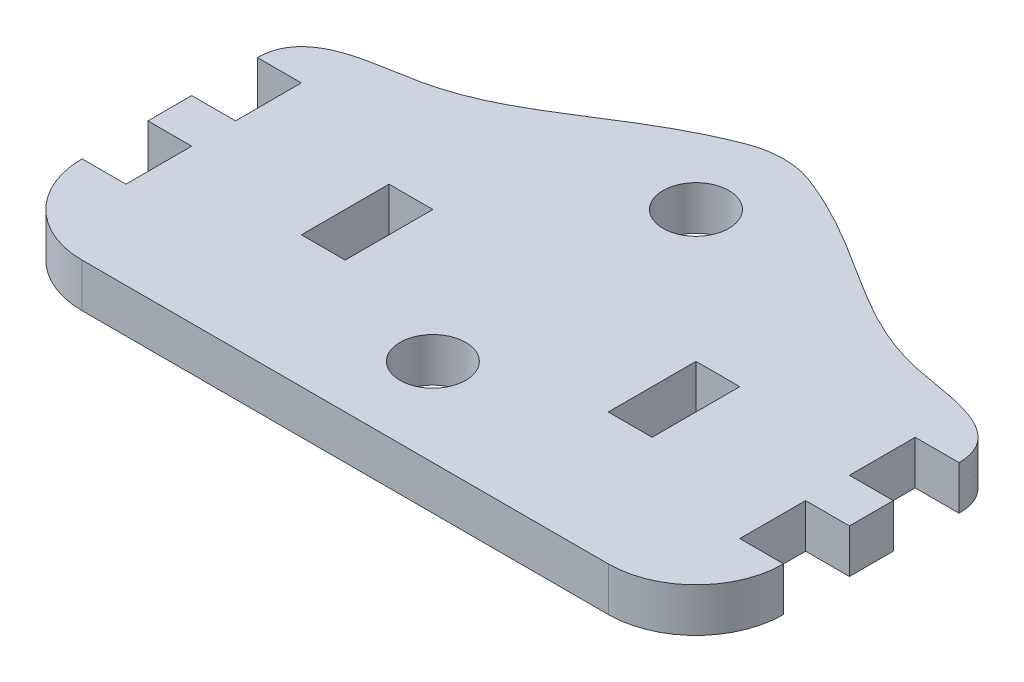
ISO-10303-21;
HEADER;
FILE_DESCRIPTION(('STEP AP214'),'2;1');
FILE_NAME('part.step','',(''),(''),'','','');
FILE_SCHEMA(('AUTOMOTIVE_DESIGN { 1 0 10303 214 1 1 1 1 }'));
ENDSEC;
DATA;
#1=APPLICATION_CONTEXT('core data for automotive mechanical design processes');
#2=APPLICATION_PROTOCOL_DEFINITION('international standard','automotive_design',2000,#1);
#3=PRODUCT_CONTEXT('',#1,'mechanical');
#4=PRODUCT('Part','Part','',(#3));
#5=PRODUCT_RELATED_PRODUCT_CATEGORY('part','',(#4));
#6=PRODUCT_DEFINITION_FORMATION('','',#4);
#7=PRODUCT_DEFINITION_CONTEXT('part definition',#1,'design');
#8=PRODUCT_DEFINITION('design','',#6,#7);
#9=PRODUCT_DEFINITION_SHAPE('','',#8);
#10=(LENGTH_UNIT() NAMED_UNIT(*) SI_UNIT(.MILLI.,.METRE.));
#11=(NAMED_UNIT(*) PLANE_ANGLE_UNIT() SI_UNIT($,.RADIAN.));
#12=(NAMED_UNIT(*) SI_UNIT($,.STERADIAN.) SOLID_ANGLE_UNIT());
#13=UNCERTAINTY_MEASURE_WITH_UNIT(LENGTH_MEASURE(1.E-05),#10,'distance_accuracy_value','');
#14=(GEOMETRIC_REPRESENTATION_CONTEXT(3) GLOBAL_UNCERTAINTY_ASSIGNED_CONTEXT((#13)) GLOBAL_UNIT_ASSIGNED_CONTEXT((#10,
#11,#12)) REPRESENTATION_CONTEXT('',''));
#15=CARTESIAN_POINT('',(0.,0.,0.));
#16=DIRECTION('',(0.,0.,1.));
#17=DIRECTION('',(1.,0.,0.));
#18=AXIS2_PLACEMENT_3D('',#15,#16,#17);
#19=CARTESIAN_POINT('',(-25.4,3.175,-12.7));
#20=CARTESIAN_POINT('',(-25.4,3.175,-13.7590259895496));
#21=CARTESIAN_POINT('',(-23.8903307645993,3.175,-16.5283902462849));
#22=CARTESIAN_POINT('',(-16.1884106721328,3.175,-16.6121941539435));
#23=CARTESIAN_POINT('',(-9.50590726739736,3.175,-21.2331543328215));
#24=CARTESIAN_POINT('',(-4.69237992312142,3.175,-24.0468904274363));
#25=CARTESIAN_POINT('',(-2.2834346962884,3.175,-24.9752363655627));
#26=B_SPLINE_CURVE_WITH_KNOTS('',3,(#19,#20,#21,#22,#23,#24,#25),.UNSPECIFIED.,.F.,.F.,(4,1,1,1,
4),(0.,0.0915734236738152,0.361911298615973,0.725975427728737,1.),.UNSPECIFIED.);
#27=DIRECTION('',(0.,-1.,0.));
#28=VECTOR('',#27,1.);
#29=SURFACE_OF_LINEAR_EXTRUSION('',#26,#28);
#30=CARTESIAN_POINT('',(-25.4,0.,-12.7));
#31=CARTESIAN_POINT('',(-25.4,0.,-13.7590259895496));
#32=CARTESIAN_POINT('',(-23.8903307645993,0.,-16.5283902462849));
#33=CARTESIAN_POINT('',(-16.1884106721328,0.,-16.6121941539435));
#34=CARTESIAN_POINT('',(-9.50590726739736,0.,-21.2331543328215));
#35=CARTESIAN_POINT('',(-4.69237992312142,0.,-24.0468904274363));
#36=CARTESIAN_POINT('',(-2.2834346962884,0.,-24.9752363655627));
#37=B_SPLINE_CURVE_WITH_KNOTS('',3,(#30,#31,#32,#33,#34,#35,#36),.UNSPECIFIED.,.F.,.F.,(4,1,1,1,
4),(0.,0.0915734236738152,0.361911298615973,0.725975427728737,1.),.UNSPECIFIED.);
#38=CARTESIAN_POINT('',(-25.4,0.,-12.7));
#39=VERTEX_POINT('',#38);
#40=CARTESIAN_POINT('',(-2.2834346962884,0.,-24.9752363655627));
#41=VERTEX_POINT('',#40);
#42=EDGE_CURVE('E278',#39,#41,#37,.T.);
#43=ORIENTED_EDGE('',*,*,#42,.F.);
#44=DIRECTION('',(0.,-1.,0.));
#45=VECTOR('',#44,1.);
#46=CARTESIAN_POINT('',(-25.4,3.175,-12.7));
#47=LINE('',#46,#45);
#48=CARTESIAN_POINT('',(-25.4,3.175,-12.7));
#49=VERTEX_POINT('',#48);
#50=EDGE_CURVE('E428',#49,#39,#47,.T.);
#51=ORIENTED_EDGE('',*,*,#50,.F.);
#52=CARTESIAN_POINT('',(-2.2834346962884,3.175,-24.9752363655627));
#53=VERTEX_POINT('',#52);
#54=EDGE_CURVE('E279',#49,#53,#26,.T.);
#55=ORIENTED_EDGE('',*,*,#54,.T.);
#56=DIRECTION('',(0.,-1.,0.));
#57=VECTOR('',#56,1.);
#58=CARTESIAN_POINT('',(-2.2834346962884,3.175,-24.9752363655627));
#59=LINE('',#58,#57);
#60=EDGE_CURVE('E497',#53,#41,#59,.T.);
#61=ORIENTED_EDGE('',*,*,#60,.T.);
#62=EDGE_LOOP('',(#43,#51,#55,#61));
#63=FACE_BOUND('',#62,.T.);
#64=ADVANCED_FACE('F44',(#63),#29,.T.);
#65=CARTESIAN_POINT('',(0.,3.175,-12.7));
#66=DIRECTION('',(0.,0.,1.));
#67=DIRECTION('',(1.,0.,0.));
#68=AXIS2_PLACEMENT_3D('',#65,#66,#67);
#69=PLANE('',#68);
#70=DIRECTION('',(-1.,0.,0.));
#71=VECTOR('',#70,1.);
#72=CARTESIAN_POINT('',(0.,0.,-12.7));
#73=LINE('',#72,#71);
#74=CARTESIAN_POINT('',(-22.225,0.,-12.7));
#75=VERTEX_POINT('',#74);
#76=EDGE_CURVE('E424',#75,#39,#73,.T.);
#77=ORIENTED_EDGE('',*,*,#76,.F.);
#78=DIRECTION('',(0.,-1.,0.));
#79=VECTOR('',#78,1.);
#80=CARTESIAN_POINT('',(-22.225,3.175,-12.7));
#81=LINE('',#80,#79);
#82=CARTESIAN_POINT('',(-22.225,3.175,-12.7));
#83=VERTEX_POINT('',#82);
#84=EDGE_CURVE('E426',#83,#75,#81,.T.);
#85=ORIENTED_EDGE('',*,*,#84,.F.);
#86=DIRECTION('',(-1.,0.,0.));
#87=VECTOR('',#86,1.);
#88=CARTESIAN_POINT('',(0.,3.175,-12.7));
#89=LINE('',#88,#87);
#90=EDGE_CURVE('E285',#83,#49,#89,.T.);
#91=ORIENTED_EDGE('',*,*,#90,.T.);
#92=ORIENTED_EDGE('',*,*,#50,.T.);
#93=EDGE_LOOP('',(#77,#85,#91,#92));
#94=FACE_BOUND('',#93,.T.);
#95=ADVANCED_FACE('F414',(#94),#69,.T.);
#96=CARTESIAN_POINT('',(-22.225,3.175,0.));
#97=DIRECTION('',(-1.,0.,0.));
#98=DIRECTION('',(0.,0.,1.));
#99=AXIS2_PLACEMENT_3D('',#96,#97,#98);
#100=PLANE('',#99);
#101=DIRECTION('',(0.,0.,-1.));
#102=VECTOR('',#101,1.);
#103=CARTESIAN_POINT('',(-22.225,0.,0.));
#104=LINE('',#103,#102);
#105=CARTESIAN_POINT('',(-22.225,0.,-7.93750000000004));
#106=VERTEX_POINT('',#105);
#107=EDGE_CURVE('E432',#106,#75,#104,.T.);
#108=ORIENTED_EDGE('',*,*,#107,.F.);
#109=DIRECTION('',(0.,-1.,0.));
#110=VECTOR('',#109,1.);
#111=CARTESIAN_POINT('',(-22.225,3.175,-7.93750000000004));
#112=LINE('',#111,#110);
#113=CARTESIAN_POINT('',(-22.225,3.175,-7.93750000000004));
#114=VERTEX_POINT('',#113);
#115=EDGE_CURVE('E537',#114,#106,#112,.T.);
#116=ORIENTED_EDGE('',*,*,#115,.F.);
#117=DIRECTION('',(0.,0.,-1.));
#118=VECTOR('',#117,1.);
#119=CARTESIAN_POINT('',(-22.225,3.175,0.));
#120=LINE('',#119,#118);
#121=EDGE_CURVE('E292',#114,#83,#120,.T.);
#122=ORIENTED_EDGE('',*,*,#121,.T.);
#123=ORIENTED_EDGE('',*,*,#84,.T.);
#124=EDGE_LOOP('',(#108,#116,#122,#123));
#125=FACE_BOUND('',#124,.T.);
#126=ADVANCED_FACE('F411',(#125),#100,.T.);
#127=CARTESIAN_POINT('',(0.,3.175,-7.93750000000004));
#128=DIRECTION('',(0.,0.,-1.));
#129=DIRECTION('',(-1.,0.,0.));
#130=AXIS2_PLACEMENT_3D('',#127,#128,#129);
#131=PLANE('',#130);
#132=DIRECTION('',(1.,0.,0.));
#133=VECTOR('',#132,1.);
#134=CARTESIAN_POINT('',(0.,0.,-7.93750000000004));
#135=LINE('',#134,#133);
#136=CARTESIAN_POINT('',(-25.4,0.,-7.93750000000004));
#137=VERTEX_POINT('',#136);
#138=EDGE_CURVE('E440',#137,#106,#135,.T.);
#139=ORIENTED_EDGE('',*,*,#138,.F.);
#140=DIRECTION('',(0.,-1.,0.));
#141=VECTOR('',#140,1.);
#142=CARTESIAN_POINT('',(-25.4,3.175,-7.93750000000004));
#143=LINE('',#142,#141);
#144=CARTESIAN_POINT('',(-25.4,3.175,-7.93750000000004));
#145=VERTEX_POINT('',#144);
#146=EDGE_CURVE('E535',#145,#137,#143,.T.);
#147=ORIENTED_EDGE('',*,*,#146,.F.);
#148=DIRECTION('',(1.,0.,0.));
#149=VECTOR('',#148,1.);
#150=CARTESIAN_POINT('',(0.,3.175,-7.93750000000004));
#151=LINE('',#150,#149);
#152=EDGE_CURVE('E295',#145,#114,#151,.T.);
#153=ORIENTED_EDGE('',*,*,#152,.T.);
#154=ORIENTED_EDGE('',*,*,#115,.T.);
#155=EDGE_LOOP('',(#139,#147,#153,#154));
#156=FACE_BOUND('',#155,.T.);
#157=ADVANCED_FACE('F407',(#156),#131,.T.);
#158=CARTESIAN_POINT('',(-25.4,3.175,0.));
#159=DIRECTION('',(-1.,0.,0.));
#160=DIRECTION('',(0.,0.,1.));
#161=AXIS2_PLACEMENT_3D('',#158,#159,#160);
#162=PLANE('',#161);
#163=DIRECTION('',(0.,0.,-1.));
#164=VECTOR('',#163,1.);
#165=CARTESIAN_POINT('',(-25.4,0.,0.));
#166=LINE('',#165,#164);
#167=CARTESIAN_POINT('',(-25.4,0.,-4.76250000000004));
#168=VERTEX_POINT('',#167);
#169=EDGE_CURVE('E442',#168,#137,#166,.T.);
#170=ORIENTED_EDGE('',*,*,#169,.F.);
#171=DIRECTION('',(0.,-1.,0.));
#172=VECTOR('',#171,1.);
#173=CARTESIAN_POINT('',(-25.4,3.175,-4.76250000000004));
#174=LINE('',#173,#172);
#175=CARTESIAN_POINT('',(-25.4,3.175,-4.76250000000004));
#176=VERTEX_POINT('',#175);
#177=EDGE_CURVE('E533',#176,#168,#174,.T.);
#178=ORIENTED_EDGE('',*,*,#177,.F.);
#179=DIRECTION('',(0.,0.,-1.));
#180=VECTOR('',#179,1.);
#181=CARTESIAN_POINT('',(-25.4,3.175,0.));
#182=LINE('',#181,#180);
#183=EDGE_CURVE('E298',#176,#145,#182,.T.);
#184=ORIENTED_EDGE('',*,*,#183,.T.);
#185=ORIENTED_EDGE('',*,*,#146,.T.);
#186=EDGE_LOOP('',(#170,#178,#184,#185));
#187=FACE_BOUND('',#186,.T.);
#188=ADVANCED_FACE('F403',(#187),#162,.T.);
#189=CARTESIAN_POINT('',(0.,3.175,-4.76250000000004));
#190=DIRECTION('',(0.,0.,-1.));
#191=DIRECTION('',(-1.,0.,0.));
#192=AXIS2_PLACEMENT_3D('',#189,#190,#191);
#193=PLANE('',#192);
#194=DIRECTION('',(1.,0.,0.));
#195=VECTOR('',#194,1.);
#196=CARTESIAN_POINT('',(0.,0.,-4.76250000000004));
#197=LINE('',#196,#195);
#198=CARTESIAN_POINT('',(-22.225,0.,-4.76250000000004));
#199=VERTEX_POINT('',#198);
#200=EDGE_CURVE('E447',#168,#199,#197,.T.);
#201=ORIENTED_EDGE('',*,*,#200,.T.);
#202=DIRECTION('',(0.,-1.,0.));
#203=VECTOR('',#202,1.);
#204=CARTESIAN_POINT('',(-22.225,3.175,-4.76250000000004));
#205=LINE('',#204,#203);
#206=CARTESIAN_POINT('',(-22.225,3.175,-4.76250000000004));
#207=VERTEX_POINT('',#206);
#208=EDGE_CURVE('E531',#207,#199,#205,.T.);
#209=ORIENTED_EDGE('',*,*,#208,.F.);
#210=DIRECTION('',(1.,0.,0.));
#211=VECTOR('',#210,1.);
#212=CARTESIAN_POINT('',(0.,3.175,-4.76250000000004));
#213=LINE('',#212,#211);
#214=EDGE_CURVE('E301',#176,#207,#213,.T.);
#215=ORIENTED_EDGE('',*,*,#214,.F.);
#216=ORIENTED_EDGE('',*,*,#177,.T.);
#217=EDGE_LOOP('',(#201,#209,#215,#216));
#218=FACE_BOUND('',#217,.T.);
#219=ADVANCED_FACE('F399',(#218),#193,.F.);
#220=CARTESIAN_POINT('',(-22.225,3.175,0.));
#221=DIRECTION('',(-1.,0.,0.));
#222=DIRECTION('',(0.,0.,1.));
#223=AXIS2_PLACEMENT_3D('',#220,#221,#222);
#224=PLANE('',#223);
#225=DIRECTION('',(0.,0.,-1.));
#226=VECTOR('',#225,1.);
#227=CARTESIAN_POINT('',(-22.225,0.,0.));
#228=LINE('',#227,#226);
#229=CARTESIAN_POINT('',(-22.225,0.,0.));
#230=VERTEX_POINT('',#229);
#231=EDGE_CURVE('E450',#230,#199,#228,.T.);
#232=ORIENTED_EDGE('',*,*,#231,.F.);
#233=DIRECTION('',(0.,-1.,0.));
#234=VECTOR('',#233,1.);
#235=CARTESIAN_POINT('',(-22.225,3.175,0.));
#236=LINE('',#235,#234);
#237=CARTESIAN_POINT('',(-22.225,3.175,0.));
#238=VERTEX_POINT('',#237);
#239=EDGE_CURVE('E529',#238,#230,#236,.T.);
#240=ORIENTED_EDGE('',*,*,#239,.F.);
#241=DIRECTION('',(0.,0.,-1.));
#242=VECTOR('',#241,1.);
#243=CARTESIAN_POINT('',(-22.225,3.175,0.));
#244=LINE('',#243,#242);
#245=EDGE_CURVE('E303',#238,#207,#244,.T.);
#246=ORIENTED_EDGE('',*,*,#245,.T.);
#247=ORIENTED_EDGE('',*,*,#208,.T.);
#248=EDGE_LOOP('',(#232,#240,#246,#247));
#249=FACE_BOUND('',#248,.T.);
#250=ADVANCED_FACE('F395',(#249),#224,.T.);
#251=CARTESIAN_POINT('',(0.,3.175,0.));
#252=DIRECTION('',(0.,0.,-1.));
#253=DIRECTION('',(-1.,0.,0.));
#254=AXIS2_PLACEMENT_3D('',#251,#252,#253);
#255=PLANE('',#254);
#256=DIRECTION('',(1.,0.,0.));
#257=VECTOR('',#256,1.);
#258=CARTESIAN_POINT('',(0.,0.,0.));
#259=LINE('',#258,#257);
#260=CARTESIAN_POINT('',(-25.4,0.,0.));
#261=VERTEX_POINT('',#260);
#262=EDGE_CURVE('E453',#261,#230,#259,.T.);
#263=ORIENTED_EDGE('',*,*,#262,.F.);
#264=DIRECTION('',(0.,-1.,0.));
#265=VECTOR('',#264,1.);
#266=CARTESIAN_POINT('',(-25.4,3.175,0.));
#267=LINE('',#266,#265);
#268=CARTESIAN_POINT('',(-25.4,3.175,0.));
#269=VERTEX_POINT('',#268);
#270=EDGE_CURVE('E527',#269,#261,#267,.T.);
#271=ORIENTED_EDGE('',*,*,#270,.F.);
#272=DIRECTION('',(1.,0.,0.));
#273=VECTOR('',#272,1.);
#274=CARTESIAN_POINT('',(0.,3.175,0.));
#275=LINE('',#274,#273);
#276=EDGE_CURVE('E306',#269,#238,#275,.T.);
#277=ORIENTED_EDGE('',*,*,#276,.T.);
#278=ORIENTED_EDGE('',*,*,#239,.T.);
#279=EDGE_LOOP('',(#263,#271,#277,#278));
#280=FACE_BOUND('',#279,.T.);
#281=ADVANCED_FACE('F391',(#280),#255,.T.);
#282=CARTESIAN_POINT('',(-19.05,3.175,0.));
#283=DIRECTION('',(0.,-1.,0.));
#284=DIRECTION('',(0.,0.,-1.));
#285=AXIS2_PLACEMENT_3D('',#282,#283,#284);
#286=CYLINDRICAL_SURFACE('',#285,6.35);
#287=CARTESIAN_POINT('',(-19.05,0.,0.));
#288=DIRECTION('',(0.,1.,0.));
#289=DIRECTION('',(0.,0.,1.));
#290=AXIS2_PLACEMENT_3D('',#287,#288,#289);
#291=CIRCLE('',#290,6.35);
#292=CARTESIAN_POINT('',(-19.05,0.,6.35));
#293=VERTEX_POINT('',#292);
#294=EDGE_CURVE('E456',#293,#261,#291,.F.);
#295=ORIENTED_EDGE('',*,*,#294,.F.);
#296=DIRECTION('',(0.,-1.,0.));
#297=VECTOR('',#296,1.);
#298=CARTESIAN_POINT('',(-19.05,3.175,6.35));
#299=LINE('',#298,#297);
#300=CARTESIAN_POINT('',(-19.05,3.175,6.35));
#301=VERTEX_POINT('',#300);
#302=EDGE_CURVE('E525',#301,#293,#299,.T.);
#303=ORIENTED_EDGE('',*,*,#302,.F.);
#304=CARTESIAN_POINT('',(-19.05,3.175,0.));
#305=DIRECTION('',(0.,1.,0.));
#306=DIRECTION('',(0.,0.,1.));
#307=AXIS2_PLACEMENT_3D('',#304,#305,#306);
#308=CIRCLE('',#307,6.35);
#309=EDGE_CURVE('E309',#301,#269,#308,.F.);
#310=ORIENTED_EDGE('',*,*,#309,.T.);
#311=ORIENTED_EDGE('',*,*,#270,.T.);
#312=EDGE_LOOP('',(#295,#303,#310,#311));
#313=FACE_BOUND('',#312,.T.);
#314=ADVANCED_FACE('F387',(#313),#286,.T.);
#315=CARTESIAN_POINT('',(0.,3.175,6.35));
#316=DIRECTION('',(0.,0.,1.));
#317=DIRECTION('',(1.,0.,0.));
#318=AXIS2_PLACEMENT_3D('',#315,#316,#317);
#319=PLANE('',#318);
#320=DIRECTION('',(-1.,0.,0.));
#321=VECTOR('',#320,1.);
#322=CARTESIAN_POINT('',(0.,0.,6.35));
#323=LINE('',#322,#321);
#324=CARTESIAN_POINT('',(19.05,0.,6.35));
#325=VERTEX_POINT('',#324);
#326=EDGE_CURVE('E459',#325,#293,#323,.T.);
#327=ORIENTED_EDGE('',*,*,#326,.F.);
#328=DIRECTION('',(0.,-1.,0.));
#329=VECTOR('',#328,1.);
#330=CARTESIAN_POINT('',(19.05,3.175,6.35));
#331=LINE('',#330,#329);
#332=CARTESIAN_POINT('',(19.05,3.175,6.35));
#333=VERTEX_POINT('',#332);
#334=EDGE_CURVE('E523',#333,#325,#331,.T.);
#335=ORIENTED_EDGE('',*,*,#334,.F.);
#336=DIRECTION('',(-1.,0.,0.));
#337=VECTOR('',#336,1.);
#338=CARTESIAN_POINT('',(0.,3.175,6.35));
#339=LINE('',#338,#337);
#340=EDGE_CURVE('E312',#333,#301,#339,.T.);
#341=ORIENTED_EDGE('',*,*,#340,.T.);
#342=ORIENTED_EDGE('',*,*,#302,.T.);
#343=EDGE_LOOP('',(#327,#335,#341,#342));
#344=FACE_BOUND('',#343,.T.);
#345=ADVANCED_FACE('F383',(#344),#319,.T.);
#346=CARTESIAN_POINT('',(19.05,3.175,0.));
#347=DIRECTION('',(0.,-1.,0.));
#348=DIRECTION('',(0.,0.,-1.));
#349=AXIS2_PLACEMENT_3D('',#346,#347,#348);
#350=CYLINDRICAL_SURFACE('',#349,6.35);
#351=CARTESIAN_POINT('',(19.05,0.,0.));
#352=DIRECTION('',(0.,1.,0.));
#353=DIRECTION('',(0.,0.,1.));
#354=AXIS2_PLACEMENT_3D('',#351,#352,#353);
#355=CIRCLE('',#354,6.35);
#356=CARTESIAN_POINT('',(25.4,0.,0.));
#357=VERTEX_POINT('',#356);
#358=EDGE_CURVE('E462',#325,#357,#355,.T.);
#359=ORIENTED_EDGE('',*,*,#358,.T.);
#360=DIRECTION('',(0.,-1.,0.));
#361=VECTOR('',#360,1.);
#362=CARTESIAN_POINT('',(25.4,3.175,0.));
#363=LINE('',#362,#361);
#364=CARTESIAN_POINT('',(25.4,3.175,0.));
#365=VERTEX_POINT('',#364);
#366=EDGE_CURVE('E520',#365,#357,#363,.T.);
#367=ORIENTED_EDGE('',*,*,#366,.F.);
#368=CARTESIAN_POINT('',(19.05,3.175,0.));
#369=DIRECTION('',(0.,1.,0.));
#370=DIRECTION('',(0.,0.,1.));
#371=AXIS2_PLACEMENT_3D('',#368,#369,#370);
#372=CIRCLE('',#371,6.35);
#373=EDGE_CURVE('E315',#333,#365,#372,.T.);
#374=ORIENTED_EDGE('',*,*,#373,.F.);
#375=ORIENTED_EDGE('',*,*,#334,.T.);
#376=EDGE_LOOP('',(#359,#367,#374,#375));
#377=FACE_BOUND('',#376,.T.);
#378=ADVANCED_FACE('F379',(#377),#350,.T.);
#379=CARTESIAN_POINT('',(0.,3.175,0.));
#380=DIRECTION('',(0.,0.,1.));
#381=DIRECTION('',(1.,0.,0.));
#382=AXIS2_PLACEMENT_3D('',#379,#380,#381);
#383=PLANE('',#382);
#384=DIRECTION('',(-1.,0.,0.));
#385=VECTOR('',#384,1.);
#386=CARTESIAN_POINT('',(0.,0.,0.));
#387=LINE('',#386,#385);
#388=CARTESIAN_POINT('',(22.225,0.,0.));
#389=VERTEX_POINT('',#388);
#390=EDGE_CURVE('E464',#357,#389,#387,.T.);
#391=ORIENTED_EDGE('',*,*,#390,.T.);
#392=DIRECTION('',(0.,-1.,0.));
#393=VECTOR('',#392,1.);
#394=CARTESIAN_POINT('',(22.225,3.175,0.));
#395=LINE('',#394,#393);
#396=CARTESIAN_POINT('',(22.225,3.175,0.));
#397=VERTEX_POINT('',#396);
#398=EDGE_CURVE('E517',#397,#389,#395,.T.);
#399=ORIENTED_EDGE('',*,*,#398,.F.);
#400=DIRECTION('',(-1.,0.,0.));
#401=VECTOR('',#400,1.);
#402=CARTESIAN_POINT('',(0.,3.175,0.));
#403=LINE('',#402,#401);
#404=EDGE_CURVE('E317',#365,#397,#403,.T.);
#405=ORIENTED_EDGE('',*,*,#404,.F.);
#406=ORIENTED_EDGE('',*,*,#366,.T.);
#407=EDGE_LOOP('',(#391,#399,#405,#406));
#408=FACE_BOUND('',#407,.T.);
#409=ADVANCED_FACE('F375',(#408),#383,.F.);
#410=CARTESIAN_POINT('',(22.225,3.175,0.));
#411=DIRECTION('',(-1.,0.,0.));
#412=DIRECTION('',(0.,0.,1.));
#413=AXIS2_PLACEMENT_3D('',#410,#411,#412);
#414=PLANE('',#413);
#415=DIRECTION('',(0.,0.,-1.));
#416=VECTOR('',#415,1.);
#417=CARTESIAN_POINT('',(22.225,0.,0.));
#418=LINE('',#417,#416);
#419=CARTESIAN_POINT('',(22.225,0.,-4.76250000000004));
#420=VERTEX_POINT('',#419);
#421=EDGE_CURVE('E466',#389,#420,#418,.T.);
#422=ORIENTED_EDGE('',*,*,#421,.T.);
#423=DIRECTION('',(0.,-1.,0.));
#424=VECTOR('',#423,1.);
#425=CARTESIAN_POINT('',(22.225,3.175,-4.76250000000004));
#426=LINE('',#425,#424);
#427=CARTESIAN_POINT('',(22.225,3.175,-4.76250000000004));
#428=VERTEX_POINT('',#427);
#429=EDGE_CURVE('E515',#428,#420,#426,.T.);
#430=ORIENTED_EDGE('',*,*,#429,.F.);
#431=DIRECTION('',(0.,0.,-1.));
#432=VECTOR('',#431,1.);
#433=CARTESIAN_POINT('',(22.225,3.175,0.));
#434=LINE('',#433,#432);
#435=EDGE_CURVE('E319',#397,#428,#434,.T.);
#436=ORIENTED_EDGE('',*,*,#435,.F.);
#437=ORIENTED_EDGE('',*,*,#398,.T.);
#438=EDGE_LOOP('',(#422,#430,#436,#437));
#439=FACE_BOUND('',#438,.T.);
#440=ADVANCED_FACE('F371',(#439),#414,.F.);
#441=CARTESIAN_POINT('',(0.,3.175,-4.76250000000004));
#442=DIRECTION('',(0.,0.,1.));
#443=DIRECTION('',(1.,0.,0.));
#444=AXIS2_PLACEMENT_3D('',#441,#442,#443);
#445=PLANE('',#444);
#446=DIRECTION('',(-1.,0.,0.));
#447=VECTOR('',#446,1.);
#448=CARTESIAN_POINT('',(0.,0.,-4.76250000000004));
#449=LINE('',#448,#447);
#450=CARTESIAN_POINT('',(25.4,0.,-4.76250000000004));
#451=VERTEX_POINT('',#450);
#452=EDGE_CURVE('E469',#451,#420,#449,.T.);
#453=ORIENTED_EDGE('',*,*,#452,.F.);
#454=DIRECTION('',(0.,-1.,0.));
#455=VECTOR('',#454,1.);
#456=CARTESIAN_POINT('',(25.4,3.175,-4.76250000000004));
#457=LINE('',#456,#455);
#458=CARTESIAN_POINT('',(25.4,3.175,-4.76250000000004));
#459=VERTEX_POINT('',#458);
#460=EDGE_CURVE('E513',#459,#451,#457,.T.);
#461=ORIENTED_EDGE('',*,*,#460,.F.);
#462=DIRECTION('',(-1.,0.,0.));
#463=VECTOR('',#462,1.);
#464=CARTESIAN_POINT('',(0.,3.175,-4.76250000000004));
#465=LINE('',#464,#463);
#466=EDGE_CURVE('E321',#459,#428,#465,.T.);
#467=ORIENTED_EDGE('',*,*,#466,.T.);
#468=ORIENTED_EDGE('',*,*,#429,.T.);
#469=EDGE_LOOP('',(#453,#461,#467,#468));
#470=FACE_BOUND('',#469,.T.);
#471=ADVANCED_FACE('F367',(#470),#445,.T.);
#472=CARTESIAN_POINT('',(25.4,3.175,0.));
#473=DIRECTION('',(-1.,0.,0.));
#474=DIRECTION('',(0.,0.,1.));
#475=AXIS2_PLACEMENT_3D('',#472,#473,#474);
#476=PLANE('',#475);
#477=DIRECTION('',(0.,0.,-1.));
#478=VECTOR('',#477,1.);
#479=CARTESIAN_POINT('',(25.4,0.,0.));
#480=LINE('',#479,#478);
#481=CARTESIAN_POINT('',(25.4,0.,-7.93750000000004));
#482=VERTEX_POINT('',#481);
#483=EDGE_CURVE('E472',#451,#482,#480,.T.);
#484=ORIENTED_EDGE('',*,*,#483,.T.);
#485=DIRECTION('',(0.,-1.,0.));
#486=VECTOR('',#485,1.);
#487=CARTESIAN_POINT('',(25.4,3.175,-7.93750000000004));
#488=LINE('',#487,#486);
#489=CARTESIAN_POINT('',(25.4,3.175,-7.93750000000004));
#490=VERTEX_POINT('',#489);
#491=EDGE_CURVE('E510',#490,#482,#488,.T.);
#492=ORIENTED_EDGE('',*,*,#491,.F.);
#493=DIRECTION('',(0.,0.,-1.));
#494=VECTOR('',#493,1.);
#495=CARTESIAN_POINT('',(25.4,3.175,0.));
#496=LINE('',#495,#494);
#497=EDGE_CURVE('E324',#459,#490,#496,.T.);
#498=ORIENTED_EDGE('',*,*,#497,.F.);
#499=ORIENTED_EDGE('',*,*,#460,.T.);
#500=EDGE_LOOP('',(#484,#492,#498,#499));
#501=FACE_BOUND('',#500,.T.);
#502=ADVANCED_FACE('F363',(#501),#476,.F.);
#503=CARTESIAN_POINT('',(0.,3.175,-7.93750000000004));
#504=DIRECTION('',(0.,0.,1.));
#505=DIRECTION('',(1.,0.,0.));
#506=AXIS2_PLACEMENT_3D('',#503,#504,#505);
#507=PLANE('',#506);
#508=DIRECTION('',(-1.,0.,0.));
#509=VECTOR('',#508,1.);
#510=CARTESIAN_POINT('',(0.,0.,-7.93750000000004));
#511=LINE('',#510,#509);
#512=CARTESIAN_POINT('',(22.225,0.,-7.93750000000004));
#513=VERTEX_POINT('',#512);
#514=EDGE_CURVE('E474',#482,#513,#511,.T.);
#515=ORIENTED_EDGE('',*,*,#514,.T.);
#516=DIRECTION('',(0.,-1.,0.));
#517=VECTOR('',#516,1.);
#518=CARTESIAN_POINT('',(22.225,3.175,-7.93750000000004));
#519=LINE('',#518,#517);
#520=CARTESIAN_POINT('',(22.225,3.175,-7.93750000000004));
#521=VERTEX_POINT('',#520);
#522=EDGE_CURVE('E507',#521,#513,#519,.T.);
#523=ORIENTED_EDGE('',*,*,#522,.F.);
#524=DIRECTION('',(-1.,0.,0.));
#525=VECTOR('',#524,1.);
#526=CARTESIAN_POINT('',(0.,3.175,-7.93750000000004));
#527=LINE('',#526,#525);
#528=EDGE_CURVE('E326',#490,#521,#527,.T.);
#529=ORIENTED_EDGE('',*,*,#528,.F.);
#530=ORIENTED_EDGE('',*,*,#491,.T.);
#531=EDGE_LOOP('',(#515,#523,#529,#530));
#532=FACE_BOUND('',#531,.T.);
#533=ADVANCED_FACE('F359',(#532),#507,.F.);
#534=CARTESIAN_POINT('',(22.225,3.175,0.));
#535=DIRECTION('',(-1.,0.,0.));
#536=DIRECTION('',(0.,0.,1.));
#537=AXIS2_PLACEMENT_3D('',#534,#535,#536);
#538=PLANE('',#537);
#539=DIRECTION('',(0.,0.,-1.));
#540=VECTOR('',#539,1.);
#541=CARTESIAN_POINT('',(22.225,0.,0.));
#542=LINE('',#541,#540);
#543=CARTESIAN_POINT('',(22.225,0.,-12.7));
#544=VERTEX_POINT('',#543);
#545=EDGE_CURVE('E476',#513,#544,#542,.T.);
#546=ORIENTED_EDGE('',*,*,#545,.T.);
#547=DIRECTION('',(0.,-1.,0.));
#548=VECTOR('',#547,1.);
#549=CARTESIAN_POINT('',(22.225,3.175,-12.7));
#550=LINE('',#549,#548);
#551=CARTESIAN_POINT('',(22.225,3.175,-12.7));
#552=VERTEX_POINT('',#551);
#553=EDGE_CURVE('E505',#552,#544,#550,.T.);
#554=ORIENTED_EDGE('',*,*,#553,.F.);
#555=DIRECTION('',(0.,0.,-1.));
#556=VECTOR('',#555,1.);
#557=CARTESIAN_POINT('',(22.225,3.175,0.));
#558=LINE('',#557,#556);
#559=EDGE_CURVE('E328',#521,#552,#558,.T.);
#560=ORIENTED_EDGE('',*,*,#559,.F.);
#561=ORIENTED_EDGE('',*,*,#522,.T.);
#562=EDGE_LOOP('',(#546,#554,#560,#561));
#563=FACE_BOUND('',#562,.T.);
#564=ADVANCED_FACE('F355',(#563),#538,.F.);
#565=CARTESIAN_POINT('',(0.,3.175,-12.7));
#566=DIRECTION('',(0.,0.,1.));
#567=DIRECTION('',(1.,0.,0.));
#568=AXIS2_PLACEMENT_3D('',#565,#566,#567);
#569=PLANE('',#568);
#570=DIRECTION('',(-1.,0.,0.));
#571=VECTOR('',#570,1.);
#572=CARTESIAN_POINT('',(0.,0.,-12.7));
#573=LINE('',#572,#571);
#574=CARTESIAN_POINT('',(25.4,0.,-12.7));
#575=VERTEX_POINT('',#574);
#576=EDGE_CURVE('E479',#575,#544,#573,.T.);
#577=ORIENTED_EDGE('',*,*,#576,.F.);
#578=DIRECTION('',(0.,-1.,0.));
#579=VECTOR('',#578,1.);
#580=CARTESIAN_POINT('',(25.4,3.175,-12.7));
#581=LINE('',#580,#579);
#582=CARTESIAN_POINT('',(25.4,3.175,-12.7));
#583=VERTEX_POINT('',#582);
#584=EDGE_CURVE('E503',#583,#575,#581,.T.);
#585=ORIENTED_EDGE('',*,*,#584,.F.);
#586=DIRECTION('',(-1.,0.,0.));
#587=VECTOR('',#586,1.);
#588=CARTESIAN_POINT('',(0.,3.175,-12.7));
#589=LINE('',#588,#587);
#590=EDGE_CURVE('E330',#583,#552,#589,.T.);
#591=ORIENTED_EDGE('',*,*,#590,.T.);
#592=ORIENTED_EDGE('',*,*,#553,.T.);
#593=EDGE_LOOP('',(#577,#585,#591,#592));
#594=FACE_BOUND('',#593,.T.);
#595=ADVANCED_FACE('F349',(#594),#569,.T.);
#596=CARTESIAN_POINT('',(25.4,3.175,-12.7));
#597=CARTESIAN_POINT('',(25.4,3.175,-13.7590259895496));
#598=CARTESIAN_POINT('',(23.8903307645993,3.175,-16.5283902462849));
#599=CARTESIAN_POINT('',(16.1884106721328,3.175,-16.6121941539435));
#600=CARTESIAN_POINT('',(9.50590726739737,3.175,-21.2331543328215));
#601=CARTESIAN_POINT('',(4.69237992312142,3.175,-24.0468904274363));
#602=CARTESIAN_POINT('',(2.2834346962884,3.175,-24.9752363655627));
#603=B_SPLINE_CURVE_WITH_KNOTS('',3,(#596,#597,#598,#599,#600,#601,#602),.UNSPECIFIED.,.F.,.F.,
(4,1,1,1,4),(0.,0.0915734236738152,0.361911298615973,0.725975427728737,1.),.UNSPECIFIED.);
#604=DIRECTION('',(0.,-1.,0.));
#605=VECTOR('',#604,1.);
#606=SURFACE_OF_LINEAR_EXTRUSION('',#603,#605);
#607=CARTESIAN_POINT('',(25.4,0.,-12.7));
#608=CARTESIAN_POINT('',(25.4,0.,-13.7590259895496));
#609=CARTESIAN_POINT('',(23.8903307645993,0.,-16.5283902462849));
#610=CARTESIAN_POINT('',(16.1884106721328,0.,-16.6121941539435));
#611=CARTESIAN_POINT('',(9.50590726739737,0.,-21.2331543328215));
#612=CARTESIAN_POINT('',(4.69237992312142,0.,-24.0468904274363));
#613=CARTESIAN_POINT('',(2.2834346962884,0.,-24.9752363655627));
#614=B_SPLINE_CURVE_WITH_KNOTS('',3,(#607,#608,#609,#610,#611,#612,#613),.UNSPECIFIED.,.F.,.F.,
(4,1,1,1,4),(0.,0.0915734236738152,0.361911298615973,0.725975427728737,1.),.UNSPECIFIED.);
#615=CARTESIAN_POINT('',(2.2834346962884,0.,-24.9752363655627));
#616=VERTEX_POINT('',#615);
#617=EDGE_CURVE('E482',#575,#616,#614,.T.);
#618=ORIENTED_EDGE('',*,*,#617,.T.);
#619=DIRECTION('',(0.,-1.,0.));
#620=VECTOR('',#619,1.);
#621=CARTESIAN_POINT('',(2.2834346962884,3.175,-24.9752363655627));
#622=LINE('',#621,#620);
#623=CARTESIAN_POINT('',(2.2834346962884,3.175,-24.9752363655627));
#624=VERTEX_POINT('',#623);
#625=EDGE_CURVE('E499',#624,#616,#622,.T.);
#626=ORIENTED_EDGE('',*,*,#625,.F.);
#627=EDGE_CURVE('E333',#583,#624,#603,.T.);
#628=ORIENTED_EDGE('',*,*,#627,.F.);
#629=ORIENTED_EDGE('',*,*,#584,.T.);
#630=EDGE_LOOP('',(#618,#626,#628,#629));
#631=FACE_BOUND('',#630,.T.);
#632=ADVANCED_FACE('F344',(#631),#606,.F.);
#633=CARTESIAN_POINT('',(0.,3.175,-19.05));
#634=DIRECTION('',(0.,-1.,0.));
#635=DIRECTION('',(0.,0.,-1.));
#636=AXIS2_PLACEMENT_3D('',#633,#634,#635);
#637=CYLINDRICAL_SURFACE('',#636,2.38125);
#638=CARTESIAN_POINT('',(0.,3.175,-19.05));
#639=DIRECTION('',(0.,1.,0.));
#640=DIRECTION('',(0.,0.,1.));
#641=AXIS2_PLACEMENT_3D('',#638,#639,#640);
#642=CIRCLE('',#641,2.38125);
#643=CARTESIAN_POINT('',(0.,3.175,-16.66875));
#644=VERTEX_POINT('',#643);
#645=EDGE_CURVE('E603',#644,#644,#642,.T.);
#646=ORIENTED_EDGE('',*,*,#645,.T.);
#647=EDGE_LOOP('',(#646));
#648=FACE_BOUND('',#647,.T.);
#649=CARTESIAN_POINT('',(0.,0.,-19.05));
#650=DIRECTION('',(0.,1.,0.));
#651=DIRECTION('',(0.,0.,1.));
#652=AXIS2_PLACEMENT_3D('',#649,#650,#651);
#653=CIRCLE('',#652,2.38125);
#654=CARTESIAN_POINT('',(0.,0.,-16.66875));
#655=VERTEX_POINT('',#654);
#656=EDGE_CURVE('E492',#655,#655,#653,.T.);
#657=ORIENTED_EDGE('',*,*,#656,.F.);
#658=EDGE_LOOP('',(#657));
#659=FACE_BOUND('',#658,.T.);
#660=ADVANCED_FACE('F348',(#648,#659),#637,.F.);
#661=CARTESIAN_POINT('',(0.,3.175,-19.05));
#662=DIRECTION('',(0.,-1.,0.));
#663=DIRECTION('',(0.,0.,-1.));
#664=AXIS2_PLACEMENT_3D('',#661,#662,#663);
#665=CYLINDRICAL_SURFACE('',#664,6.35);
#666=CARTESIAN_POINT('',(0.,0.,-19.05));
#667=DIRECTION('',(0.,1.,0.));
#668=DIRECTION('',(0.,0.,1.));
#669=AXIS2_PLACEMENT_3D('',#666,#667,#668);
#670=CIRCLE('',#669,6.35);
#671=EDGE_CURVE('E486',#616,#41,#670,.T.);
#672=ORIENTED_EDGE('',*,*,#671,.T.);
#673=ORIENTED_EDGE('',*,*,#60,.F.);
#674=CARTESIAN_POINT('',(0.,3.175,-19.05));
#675=DIRECTION('',(0.,1.,0.));
#676=DIRECTION('',(0.,0.,1.));
#677=AXIS2_PLACEMENT_3D('',#674,#675,#676);
#678=CIRCLE('',#677,6.35);
#679=EDGE_CURVE('E338',#624,#53,#678,.T.);
#680=ORIENTED_EDGE('',*,*,#679,.F.);
#681=ORIENTED_EDGE('',*,*,#625,.T.);
#682=EDGE_LOOP('',(#672,#673,#680,#681));
#683=FACE_BOUND('',#682,.T.);
#684=ADVANCED_FACE('F351',(#683),#665,.T.);
#685=CARTESIAN_POINT('',(0.,3.175,0.));
#686=DIRECTION('',(0.,-1.,0.));
#687=DIRECTION('',(0.,0.,-1.));
#688=AXIS2_PLACEMENT_3D('',#685,#686,#687);
#689=CYLINDRICAL_SURFACE('',#688,2.38125);
#690=CARTESIAN_POINT('',(0.,3.175,0.));
#691=DIRECTION('',(0.,1.,0.));
#692=DIRECTION('',(0.,0.,1.));
#693=AXIS2_PLACEMENT_3D('',#690,#691,#692);
#694=CIRCLE('',#693,2.38125);
#695=CARTESIAN_POINT('',(0.,3.175,2.38125));
#696=VERTEX_POINT('',#695);
#697=EDGE_CURVE('E500',#696,#696,#694,.T.);
#698=ORIENTED_EDGE('',*,*,#697,.T.);
#699=EDGE_LOOP('',(#698));
#700=FACE_BOUND('',#699,.T.);
#701=CARTESIAN_POINT('',(0.,0.,0.));
#702=DIRECTION('',(0.,1.,0.));
#703=DIRECTION('',(0.,0.,1.));
#704=AXIS2_PLACEMENT_3D('',#701,#702,#703);
#705=CIRCLE('',#704,2.38125);
#706=CARTESIAN_POINT('',(0.,0.,2.38125));
#707=VERTEX_POINT('',#706);
#708=EDGE_CURVE('E286',#707,#707,#705,.T.);
#709=ORIENTED_EDGE('',*,*,#708,.F.);
#710=EDGE_LOOP('',(#709));
#711=FACE_BOUND('',#710,.T.);
#712=ADVANCED_FACE('F589',(#700,#711),#689,.F.);
#713=CARTESIAN_POINT('',(0.,3.175,0.));
#714=DIRECTION('',(0.,1.,0.));
#715=DIRECTION('',(0.,0.,1.));
#716=AXIS2_PLACEMENT_3D('',#713,#714,#715);
#717=PLANE('',#716);
#718=DIRECTION('',(0.,0.,1.));
#719=VECTOR('',#718,1.);
#720=CARTESIAN_POINT('',(-12.7000000000817,3.175,0.));
#721=LINE('',#720,#719);
#722=CARTESIAN_POINT('',(-12.7000000000817,3.17499999999953,-9.52500000007579));
#723=VERTEX_POINT('',#722);
#724=CARTESIAN_POINT('',(-12.7000000000817,3.17499999999953,-3.17500000007579));
#725=VERTEX_POINT('',#724);
#726=EDGE_CURVE('E245',#723,#725,#721,.T.);
#727=ORIENTED_EDGE('',*,*,#726,.F.);
#728=DIRECTION('',(1.,0.,0.));
#729=VECTOR('',#728,1.);
#730=CARTESIAN_POINT('',(-12.7000000000817,3.17499999999953,-9.52500000007579));
#731=LINE('',#730,#729);
#732=CARTESIAN_POINT('',(-9.52500000008166,3.17499999999953,-9.5250000000758));
#733=VERTEX_POINT('',#732);
#734=EDGE_CURVE('E231',#723,#733,#731,.T.);
#735=ORIENTED_EDGE('',*,*,#734,.T.);
#736=DIRECTION('',(0.,0.,1.));
#737=VECTOR('',#736,1.);
#738=CARTESIAN_POINT('',(-9.52500000008166,3.175,0.));
#739=LINE('',#738,#737);
#740=CARTESIAN_POINT('',(-9.52500000008166,3.175,-3.1750000000758));
#741=VERTEX_POINT('',#740);
#742=EDGE_CURVE('E239',#733,#741,#739,.T.);
#743=ORIENTED_EDGE('',*,*,#742,.T.);
#744=DIRECTION('',(1.,0.,0.));
#745=VECTOR('',#744,1.);
#746=CARTESIAN_POINT('',(-12.7000000000817,3.17499999999953,-3.17500000007579));
#747=LINE('',#746,#745);
#748=EDGE_CURVE('E59',#725,#741,#747,.T.);
#749=ORIENTED_EDGE('',*,*,#748,.F.);
#750=EDGE_LOOP('',(#727,#735,#743,#749));
#751=FACE_BOUND('',#750,.T.);
#752=DIRECTION('',(0.,0.,1.));
#753=VECTOR('',#752,1.);
#754=CARTESIAN_POINT('',(9.52499999991831,3.175,0.));
#755=LINE('',#754,#753);
#756=CARTESIAN_POINT('',(9.52499999991831,3.17499999999956,-9.52500000007574));
#757=VERTEX_POINT('',#756);
#758=CARTESIAN_POINT('',(9.52499999991831,3.17499999999956,-3.17500000007574));
#759=VERTEX_POINT('',#758);
#760=EDGE_CURVE('E277',#757,#759,#755,.T.);
#761=ORIENTED_EDGE('',*,*,#760,.F.);
#762=DIRECTION('',(1.,0.,0.));
#763=VECTOR('',#762,1.);
#764=CARTESIAN_POINT('',(9.52499999991831,3.17499999999956,-9.52500000007574));
#765=LINE('',#764,#763);
#766=CARTESIAN_POINT('',(12.6999999999183,3.17499999999956,-9.52500000007574));
#767=VERTEX_POINT('',#766);
#768=EDGE_CURVE('E271',#757,#767,#765,.T.);
#769=ORIENTED_EDGE('',*,*,#768,.T.);
#770=DIRECTION('',(0.,0.,1.));
#771=VECTOR('',#770,1.);
#772=CARTESIAN_POINT('',(12.6999999999183,3.175,0.));
#773=LINE('',#772,#771);
#774=CARTESIAN_POINT('',(12.6999999999183,3.175,-3.17500000007574));
#775=VERTEX_POINT('',#774);
#776=EDGE_CURVE('E274',#767,#775,#773,.T.);
#777=ORIENTED_EDGE('',*,*,#776,.T.);
#778=DIRECTION('',(1.,0.,0.));
#779=VECTOR('',#778,1.);
#780=CARTESIAN_POINT('',(9.52499999991831,3.17499999999956,-3.17500000007574));
#781=LINE('',#780,#779);
#782=EDGE_CURVE('E263',#759,#775,#781,.T.);
#783=ORIENTED_EDGE('',*,*,#782,.F.);
#784=EDGE_LOOP('',(#761,#769,#777,#783));
#785=FACE_BOUND('',#784,.T.);
#786=ORIENTED_EDGE('',*,*,#54,.F.);
#787=ORIENTED_EDGE('',*,*,#90,.F.);
#788=ORIENTED_EDGE('',*,*,#121,.F.);
#789=ORIENTED_EDGE('',*,*,#152,.F.);
#790=ORIENTED_EDGE('',*,*,#183,.F.);
#791=ORIENTED_EDGE('',*,*,#214,.T.);
#792=ORIENTED_EDGE('',*,*,#245,.F.);
#793=ORIENTED_EDGE('',*,*,#276,.F.);
#794=ORIENTED_EDGE('',*,*,#309,.F.);
#795=ORIENTED_EDGE('',*,*,#340,.F.);
#796=ORIENTED_EDGE('',*,*,#373,.T.);
#797=ORIENTED_EDGE('',*,*,#404,.T.);
#798=ORIENTED_EDGE('',*,*,#435,.T.);
#799=ORIENTED_EDGE('',*,*,#466,.F.);
#800=ORIENTED_EDGE('',*,*,#497,.T.);
#801=ORIENTED_EDGE('',*,*,#528,.T.);
#802=ORIENTED_EDGE('',*,*,#559,.T.);
#803=ORIENTED_EDGE('',*,*,#590,.F.);
#804=ORIENTED_EDGE('',*,*,#627,.T.);
#805=ORIENTED_EDGE('',*,*,#679,.T.);
#806=EDGE_LOOP('',(#786,#787,#788,#789,#790,#791,#792,#793,#794,#795,#796,#797,#798,#799,#800,
#801,#802,#803,#804,#805));
#807=FACE_BOUND('',#806,.T.);
#808=ORIENTED_EDGE('',*,*,#645,.F.);
#809=EDGE_LOOP('',(#808));
#810=FACE_BOUND('',#809,.T.);
#811=ORIENTED_EDGE('',*,*,#697,.F.);
#812=EDGE_LOOP('',(#811));
#813=FACE_BOUND('',#812,.T.);
#814=ADVANCED_FACE('F249',(#751,#785,#807,#810,#813),#717,.T.);
#815=CARTESIAN_POINT('',(0.,0.,0.));
#816=DIRECTION('',(0.,1.,0.));
#817=DIRECTION('',(0.,0.,1.));
#818=AXIS2_PLACEMENT_3D('',#815,#816,#817);
#819=PLANE('',#818);
#820=DIRECTION('',(1.,0.,0.));
#821=VECTOR('',#820,1.);
#822=CARTESIAN_POINT('',(-12.7000000000817,-4.75314232417645E-13,-9.52500000007579));
#823=LINE('',#822,#821);
#824=CARTESIAN_POINT('',(-12.7000000000817,-4.75314232417645E-13,-9.52500000007579));
#825=VERTEX_POINT('',#824);
#826=CARTESIAN_POINT('',(-9.52500000008166,0.,-9.5250000000758));
#827=VERTEX_POINT('',#826);
#828=EDGE_CURVE('E240',#825,#827,#823,.T.);
#829=ORIENTED_EDGE('',*,*,#828,.F.);
#830=DIRECTION('',(0.,0.,1.));
#831=VECTOR('',#830,1.);
#832=CARTESIAN_POINT('',(-12.7000000000817,0.,0.));
#833=LINE('',#832,#831);
#834=CARTESIAN_POINT('',(-12.7000000000817,0.,-3.17500000007579));
#835=VERTEX_POINT('',#834);
#836=EDGE_CURVE('E13',#825,#835,#833,.T.);
#837=ORIENTED_EDGE('',*,*,#836,.T.);
#838=DIRECTION('',(-1.,0.,0.));
#839=VECTOR('',#838,1.);
#840=CARTESIAN_POINT('',(0.,0.,-3.1750000000758));
#841=LINE('',#840,#839);
#842=CARTESIAN_POINT('',(-9.52500000008166,0.,-3.1750000000758));
#843=VERTEX_POINT('',#842);
#844=EDGE_CURVE('E52',#843,#835,#841,.T.);
#845=ORIENTED_EDGE('',*,*,#844,.F.);
#846=DIRECTION('',(0.,0.,1.));
#847=VECTOR('',#846,1.);
#848=CARTESIAN_POINT('',(-9.52500000008166,0.,0.));
#849=LINE('',#848,#847);
#850=EDGE_CURVE('E548',#827,#843,#849,.T.);
#851=ORIENTED_EDGE('',*,*,#850,.F.);
#852=EDGE_LOOP('',(#829,#837,#845,#851));
#853=FACE_BOUND('',#852,.T.);
#854=DIRECTION('',(1.,0.,0.));
#855=VECTOR('',#854,1.);
#856=CARTESIAN_POINT('',(9.52499999991831,-4.40619762898109E-13,-9.52500000007574));
#857=LINE('',#856,#855);
#858=CARTESIAN_POINT('',(9.52499999991831,-4.40619762898109E-13,-9.52500000007574));
#859=VERTEX_POINT('',#858);
#860=CARTESIAN_POINT('',(12.6999999999183,0.,-9.52500000007574));
#861=VERTEX_POINT('',#860);
#862=EDGE_CURVE('E268',#859,#861,#857,.T.);
#863=ORIENTED_EDGE('',*,*,#862,.F.);
#864=DIRECTION('',(0.,0.,1.));
#865=VECTOR('',#864,1.);
#866=CARTESIAN_POINT('',(9.52499999991831,0.,0.));
#867=LINE('',#866,#865);
#868=CARTESIAN_POINT('',(9.52499999991831,0.,-3.17500000007574));
#869=VERTEX_POINT('',#868);
#870=EDGE_CURVE('E545',#859,#869,#867,.T.);
#871=ORIENTED_EDGE('',*,*,#870,.T.);
#872=DIRECTION('',(-1.,0.,0.));
#873=VECTOR('',#872,1.);
#874=CARTESIAN_POINT('',(0.,0.,-3.17500000007574));
#875=LINE('',#874,#873);
#876=CARTESIAN_POINT('',(12.6999999999183,0.,-3.17500000007574));
#877=VERTEX_POINT('',#876);
#878=EDGE_CURVE('E543',#877,#869,#875,.T.);
#879=ORIENTED_EDGE('',*,*,#878,.F.);
#880=DIRECTION('',(0.,0.,1.));
#881=VECTOR('',#880,1.);
#882=CARTESIAN_POINT('',(12.6999999999183,0.,0.));
#883=LINE('',#882,#881);
#884=EDGE_CURVE('E541',#861,#877,#883,.T.);
#885=ORIENTED_EDGE('',*,*,#884,.F.);
#886=EDGE_LOOP('',(#863,#871,#879,#885));
#887=FACE_BOUND('',#886,.T.);
#888=ORIENTED_EDGE('',*,*,#42,.T.);
#889=ORIENTED_EDGE('',*,*,#671,.F.);
#890=ORIENTED_EDGE('',*,*,#617,.F.);
#891=ORIENTED_EDGE('',*,*,#576,.T.);
#892=ORIENTED_EDGE('',*,*,#545,.F.);
#893=ORIENTED_EDGE('',*,*,#514,.F.);
#894=ORIENTED_EDGE('',*,*,#483,.F.);
#895=ORIENTED_EDGE('',*,*,#452,.T.);
#896=ORIENTED_EDGE('',*,*,#421,.F.);
#897=ORIENTED_EDGE('',*,*,#390,.F.);
#898=ORIENTED_EDGE('',*,*,#358,.F.);
#899=ORIENTED_EDGE('',*,*,#326,.T.);
#900=ORIENTED_EDGE('',*,*,#294,.T.);
#901=ORIENTED_EDGE('',*,*,#262,.T.);
#902=ORIENTED_EDGE('',*,*,#231,.T.);
#903=ORIENTED_EDGE('',*,*,#200,.F.);
#904=ORIENTED_EDGE('',*,*,#169,.T.);
#905=ORIENTED_EDGE('',*,*,#138,.T.);
#906=ORIENTED_EDGE('',*,*,#107,.T.);
#907=ORIENTED_EDGE('',*,*,#76,.T.);
#908=EDGE_LOOP('',(#888,#889,#890,#891,#892,#893,#894,#895,#896,#897,#898,#899,#900,#901,#902,
#903,#904,#905,#906,#907));
#909=FACE_BOUND('',#908,.T.);
#910=ORIENTED_EDGE('',*,*,#656,.T.);
#911=EDGE_LOOP('',(#910));
#912=FACE_BOUND('',#911,.T.);
#913=ORIENTED_EDGE('',*,*,#708,.T.);
#914=EDGE_LOOP('',(#913));
#915=FACE_BOUND('',#914,.T.);
#916=ADVANCED_FACE('F436',(#853,#887,#909,#912,#915),#819,.F.);
#917=CARTESIAN_POINT('',(9.52499999991832,-15.8750000000004,-3.17500000007574));
#918=DIRECTION('',(0.,0.,-1.));
#919=DIRECTION('',(0.,-1.,0.));
#920=AXIS2_PLACEMENT_3D('',#917,#918,#919);
#921=PLANE('',#920);
#922=ORIENTED_EDGE('',*,*,#878,.T.);
#923=DIRECTION('',(0.,-1.,0.));
#924=VECTOR('',#923,1.);
#925=CARTESIAN_POINT('',(9.52499999991832,-15.8750000000004,-3.17500000007574));
#926=LINE('',#925,#924);
#927=EDGE_CURVE('E261',#759,#869,#926,.T.);
#928=ORIENTED_EDGE('',*,*,#927,.F.);
#929=ORIENTED_EDGE('',*,*,#782,.T.);
#930=DIRECTION('',(0.,1.,0.));
#931=VECTOR('',#930,1.);
#932=CARTESIAN_POINT('',(12.6999999999183,-15.8750000000004,-3.17500000007574));
#933=LINE('',#932,#931);
#934=EDGE_CURVE('E254',#877,#775,#933,.T.);
#935=ORIENTED_EDGE('',*,*,#934,.F.);
#936=EDGE_LOOP('',(#922,#928,#929,#935));
#937=FACE_BOUND('',#936,.T.);
#938=ADVANCED_FACE('F576',(#937),#921,.T.);
#939=CARTESIAN_POINT('',(9.52499999991832,-15.8750000000004,-6.35000000007574));
#940=DIRECTION('',(-1.,0.,0.));
#941=DIRECTION('',(0.,-1.,0.));
#942=AXIS2_PLACEMENT_3D('',#939,#940,#941);
#943=PLANE('',#942);
#944=ORIENTED_EDGE('',*,*,#760,.T.);
#945=ORIENTED_EDGE('',*,*,#927,.T.);
#946=ORIENTED_EDGE('',*,*,#870,.F.);
#947=DIRECTION('',(0.,1.,0.));
#948=VECTOR('',#947,1.);
#949=CARTESIAN_POINT('',(9.52499999991832,-15.8750000000004,-9.52500000007574));
#950=LINE('',#949,#948);
#951=EDGE_CURVE('E258',#859,#757,#950,.T.);
#952=ORIENTED_EDGE('',*,*,#951,.T.);
#953=EDGE_LOOP('',(#944,#945,#946,#952));
#954=FACE_BOUND('',#953,.T.);
#955=ADVANCED_FACE('F572',(#954),#943,.F.);
#956=CARTESIAN_POINT('',(12.6999999999183,-15.8750000000004,-6.35000000007574));
#957=DIRECTION('',(-1.,0.,0.));
#958=DIRECTION('',(0.,-1.,0.));
#959=AXIS2_PLACEMENT_3D('',#956,#957,#958);
#960=PLANE('',#959);
#961=DIRECTION('',(0.,1.,0.));
#962=VECTOR('',#961,1.);
#963=CARTESIAN_POINT('',(12.6999999999183,-15.8750000000004,-9.52500000007574));
#964=LINE('',#963,#962);
#965=EDGE_CURVE('E251',#861,#767,#964,.T.);
#966=ORIENTED_EDGE('',*,*,#965,.F.);
#967=ORIENTED_EDGE('',*,*,#884,.T.);
#968=ORIENTED_EDGE('',*,*,#934,.T.);
#969=ORIENTED_EDGE('',*,*,#776,.F.);
#970=EDGE_LOOP('',(#966,#967,#968,#969));
#971=FACE_BOUND('',#970,.T.);
#972=ADVANCED_FACE('F575',(#971),#960,.T.);
#973=CARTESIAN_POINT('',(9.52499999991832,-15.8750000000004,-9.52500000007574));
#974=DIRECTION('',(0.,0.,-1.));
#975=DIRECTION('',(0.,-1.,0.));
#976=AXIS2_PLACEMENT_3D('',#973,#974,#975);
#977=PLANE('',#976);
#978=ORIENTED_EDGE('',*,*,#965,.T.);
#979=ORIENTED_EDGE('',*,*,#768,.F.);
#980=ORIENTED_EDGE('',*,*,#951,.F.);
#981=ORIENTED_EDGE('',*,*,#862,.T.);
#982=EDGE_LOOP('',(#978,#979,#980,#981));
#983=FACE_BOUND('',#982,.T.);
#984=ADVANCED_FACE('F570',(#983),#977,.F.);
#985=CARTESIAN_POINT('',(-12.7000000000816,-15.8750000000005,-3.17500000007579));
#986=DIRECTION('',(0.,0.,-1.));
#987=DIRECTION('',(0.,-1.,0.));
#988=AXIS2_PLACEMENT_3D('',#985,#986,#987);
#989=PLANE('',#988);
#990=ORIENTED_EDGE('',*,*,#844,.T.);
#991=DIRECTION('',(0.,-1.,0.));
#992=VECTOR('',#991,1.);
#993=CARTESIAN_POINT('',(-12.7000000000816,-15.8750000000005,-3.17500000007579));
#994=LINE('',#993,#992);
#995=EDGE_CURVE('E246',#725,#835,#994,.T.);
#996=ORIENTED_EDGE('',*,*,#995,.F.);
#997=ORIENTED_EDGE('',*,*,#748,.T.);
#998=DIRECTION('',(0.,1.,0.));
#999=VECTOR('',#998,1.);
#1000=CARTESIAN_POINT('',(-9.52500000008165,-15.8750000000005,-3.1750000000758));
#1001=LINE('',#1000,#999);
#1002=EDGE_CURVE('E247',#843,#741,#1001,.T.);
#1003=ORIENTED_EDGE('',*,*,#1002,.F.);
#1004=EDGE_LOOP('',(#990,#996,#997,#1003));
#1005=FACE_BOUND('',#1004,.T.);
#1006=ADVANCED_FACE('F550',(#1005),#989,.T.);
#1007=CARTESIAN_POINT('',(-12.7000000000816,-15.8750000000005,-6.35000000007579));
#1008=DIRECTION('',(-1.,0.,0.));
#1009=DIRECTION('',(0.,-1.,0.));
#1010=AXIS2_PLACEMENT_3D('',#1007,#1008,#1009);
#1011=PLANE('',#1010);
#1012=ORIENTED_EDGE('',*,*,#726,.T.);
#1013=ORIENTED_EDGE('',*,*,#995,.T.);
#1014=ORIENTED_EDGE('',*,*,#836,.F.);
#1015=DIRECTION('',(0.,1.,0.));
#1016=VECTOR('',#1015,1.);
#1017=CARTESIAN_POINT('',(-12.7000000000816,-15.8750000000005,-9.52500000007579));
#1018=LINE('',#1017,#1016);
#1019=EDGE_CURVE('E234',#825,#723,#1018,.T.);
#1020=ORIENTED_EDGE('',*,*,#1019,.T.);
#1021=EDGE_LOOP('',(#1012,#1013,#1014,#1020));
#1022=FACE_BOUND('',#1021,.T.);
#1023=ADVANCED_FACE('F243',(#1022),#1011,.F.);
#1024=CARTESIAN_POINT('',(-9.52500000008165,-15.8750000000005,-6.3500000000758));
#1025=DIRECTION('',(-1.,0.,0.));
#1026=DIRECTION('',(0.,-1.,0.));
#1027=AXIS2_PLACEMENT_3D('',#1024,#1025,#1026);
#1028=PLANE('',#1027);
#1029=DIRECTION('',(0.,1.,0.));
#1030=VECTOR('',#1029,1.);
#1031=CARTESIAN_POINT('',(-9.52500000008165,-15.8750000000005,-9.5250000000758));
#1032=LINE('',#1031,#1030);
#1033=EDGE_CURVE('E67',#827,#733,#1032,.T.);
#1034=ORIENTED_EDGE('',*,*,#1033,.F.);
#1035=ORIENTED_EDGE('',*,*,#850,.T.);
#1036=ORIENTED_EDGE('',*,*,#1002,.T.);
#1037=ORIENTED_EDGE('',*,*,#742,.F.);
#1038=EDGE_LOOP('',(#1034,#1035,#1036,#1037));
#1039=FACE_BOUND('',#1038,.T.);
#1040=ADVANCED_FACE('F559',(#1039),#1028,.T.);
#1041=CARTESIAN_POINT('',(-12.7000000000816,-15.8750000000005,-9.52500000007579));
#1042=DIRECTION('',(0.,0.,-1.));
#1043=DIRECTION('',(0.,-1.,0.));
#1044=AXIS2_PLACEMENT_3D('',#1041,#1042,#1043);
#1045=PLANE('',#1044);
#1046=ORIENTED_EDGE('',*,*,#1033,.T.);
#1047=ORIENTED_EDGE('',*,*,#734,.F.);
#1048=ORIENTED_EDGE('',*,*,#1019,.F.);
#1049=ORIENTED_EDGE('',*,*,#828,.T.);
#1050=EDGE_LOOP('',(#1046,#1047,#1048,#1049));
#1051=FACE_BOUND('',#1050,.T.);
#1052=ADVANCED_FACE('F233',(#1051),#1045,.F.);
#1053=CLOSED_SHELL('',(#64,#95,#126,#157,#188,#219,#250,#281,#314,#345,#378,#409,#440,#471,#502,
#533,#564,#595,#632,#660,#684,#712,#814,#916,#938,#955,#972,#984,#1006,#1023,#1040,#1052));
#1054=MANIFOLD_SOLID_BREP('B2',#1053);
#1055=ADVANCED_BREP_SHAPE_REPRESENTATION('',(#18,#1054),#14);
#1056=SHAPE_DEFINITION_REPRESENTATION(#9,#1055);
ENDSEC;
END-ISO-10303-21;
